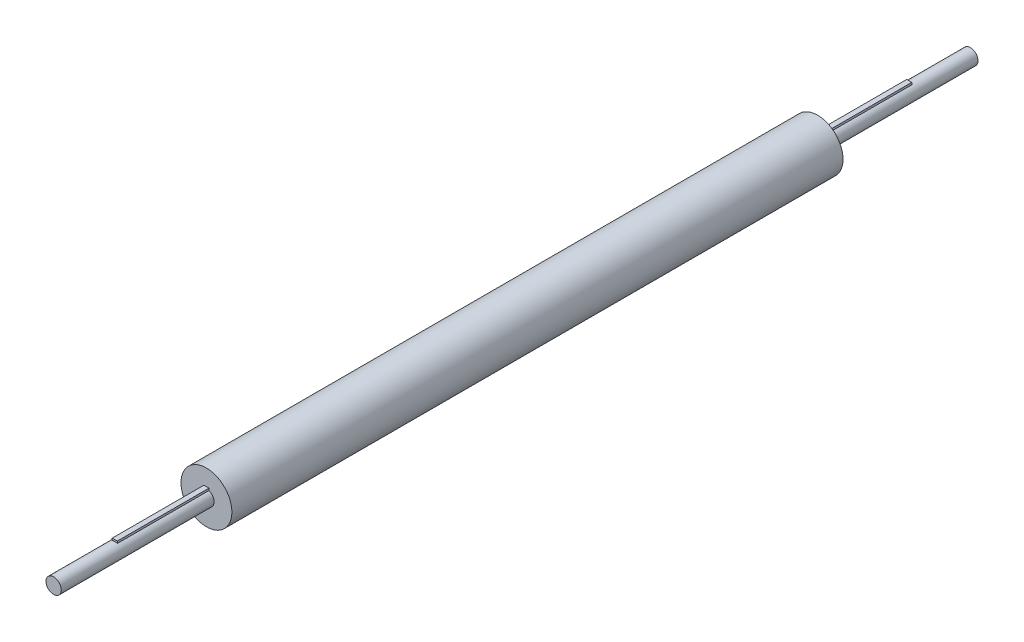
ISO-10303-21;
HEADER;
FILE_DESCRIPTION(('STEP AP214'),'2;1');
FILE_NAME('part.step','',(''),(''),'','','');
FILE_SCHEMA(('AUTOMOTIVE_DESIGN { 1 0 10303 214 1 1 1 1 }'));
ENDSEC;
DATA;
#1=APPLICATION_CONTEXT('core data for automotive mechanical design processes');
#2=APPLICATION_PROTOCOL_DEFINITION('international standard','automotive_design',2000,#1);
#3=PRODUCT_CONTEXT('',#1,'mechanical');
#4=PRODUCT('Part','Part','',(#3));
#5=PRODUCT_RELATED_PRODUCT_CATEGORY('part','',(#4));
#6=PRODUCT_DEFINITION_FORMATION('','',#4);
#7=PRODUCT_DEFINITION_CONTEXT('part definition',#1,'design');
#8=PRODUCT_DEFINITION('design','',#6,#7);
#9=PRODUCT_DEFINITION_SHAPE('','',#8);
#10=(LENGTH_UNIT() NAMED_UNIT(*) SI_UNIT(.MILLI.,.METRE.));
#11=(NAMED_UNIT(*) PLANE_ANGLE_UNIT() SI_UNIT($,.RADIAN.));
#12=(NAMED_UNIT(*) SI_UNIT($,.STERADIAN.) SOLID_ANGLE_UNIT());
#13=UNCERTAINTY_MEASURE_WITH_UNIT(LENGTH_MEASURE(1.E-05),#10,'distance_accuracy_value','');
#14=(GEOMETRIC_REPRESENTATION_CONTEXT(3) GLOBAL_UNCERTAINTY_ASSIGNED_CONTEXT((#13)) GLOBAL_UNIT_ASSIGNED_CONTEXT((#10,
#11,#12)) REPRESENTATION_CONTEXT('',''));
#15=CARTESIAN_POINT('',(0.,0.,0.));
#16=DIRECTION('',(0.,0.,1.));
#17=DIRECTION('',(1.,0.,0.));
#18=AXIS2_PLACEMENT_3D('',#15,#16,#17);
#19=CARTESIAN_POINT('',(-5.,14.1421356237309,800.));
#20=DIRECTION('',(1.,0.,0.));
#21=DIRECTION('',(0.,0.,-1.));
#22=AXIS2_PLACEMENT_3D('',#19,#20,#21);
#23=PLANE('',#22);
#24=DIRECTION('',(0.,1.,0.));
#25=VECTOR('',#24,1.);
#26=CARTESIAN_POINT('',(-5.,14.1421356237309,-780.));
#27=LINE('',#26,#25);
#28=CARTESIAN_POINT('',(-5.,14.1421356237309,-780.));
#29=VERTEX_POINT('',#28);
#30=CARTESIAN_POINT('',(-5.,18.3,-780.));
#31=VERTEX_POINT('',#30);
#32=EDGE_CURVE('E116',#29,#31,#27,.T.);
#33=ORIENTED_EDGE('',*,*,#32,.F.);
#34=DIRECTION('',(0.,0.,-1.));
#35=VECTOR('',#34,1.);
#36=CARTESIAN_POINT('',(-5.,14.1421356237309,800.));
#37=LINE('',#36,#35);
#38=CARTESIAN_POINT('',(-5.,14.1421356237309,-600.));
#39=VERTEX_POINT('',#38);
#40=EDGE_CURVE('E141',#39,#29,#37,.T.);
#41=ORIENTED_EDGE('',*,*,#40,.F.);
#42=DIRECTION('',(0.,-1.,0.));
#43=VECTOR('',#42,1.);
#44=CARTESIAN_POINT('',(-5.,14.1421356237309,-600.));
#45=LINE('',#44,#43);
#46=CARTESIAN_POINT('',(-5.,18.3,-600.));
#47=VERTEX_POINT('',#46);
#48=EDGE_CURVE('E51',#47,#39,#45,.T.);
#49=ORIENTED_EDGE('',*,*,#48,.F.);
#50=DIRECTION('',(0.,0.,-1.));
#51=VECTOR('',#50,1.);
#52=CARTESIAN_POINT('',(-5.,18.3,800.));
#53=LINE('',#52,#51);
#54=EDGE_CURVE('E128',#47,#31,#53,.T.);
#55=ORIENTED_EDGE('',*,*,#54,.T.);
#56=EDGE_LOOP('',(#33,#41,#49,#55));
#57=FACE_BOUND('',#56,.T.);
#58=ADVANCED_FACE('F43',(#57),#23,.F.);
#59=CARTESIAN_POINT('',(-5.,18.3,800.));
#60=DIRECTION('',(0.,-1.,0.));
#61=DIRECTION('',(0.,0.,-1.));
#62=AXIS2_PLACEMENT_3D('',#59,#60,#61);
#63=PLANE('',#62);
#64=DIRECTION('',(1.,0.,0.));
#65=VECTOR('',#64,1.);
#66=CARTESIAN_POINT('',(-5.,18.3,-780.));
#67=LINE('',#66,#65);
#68=CARTESIAN_POINT('',(5.,18.3,-780.));
#69=VERTEX_POINT('',#68);
#70=EDGE_CURVE('E111',#31,#69,#67,.T.);
#71=ORIENTED_EDGE('',*,*,#70,.F.);
#72=ORIENTED_EDGE('',*,*,#54,.F.);
#73=DIRECTION('',(-1.,0.,0.));
#74=VECTOR('',#73,1.);
#75=CARTESIAN_POINT('',(-5.,18.3,-600.));
#76=LINE('',#75,#74);
#77=CARTESIAN_POINT('',(5.,18.3,-600.));
#78=VERTEX_POINT('',#77);
#79=EDGE_CURVE('E66',#78,#47,#76,.T.);
#80=ORIENTED_EDGE('',*,*,#79,.F.);
#81=DIRECTION('',(0.,0.,-1.));
#82=VECTOR('',#81,1.);
#83=CARTESIAN_POINT('',(5.,18.3,800.));
#84=LINE('',#83,#82);
#85=EDGE_CURVE('E120',#78,#69,#84,.T.);
#86=ORIENTED_EDGE('',*,*,#85,.T.);
#87=EDGE_LOOP('',(#71,#72,#80,#86));
#88=FACE_BOUND('',#87,.T.);
#89=ADVANCED_FACE('F124',(#88),#63,.F.);
#90=CARTESIAN_POINT('',(5.,18.3,800.));
#91=DIRECTION('',(-1.,0.,0.));
#92=DIRECTION('',(0.,0.,1.));
#93=AXIS2_PLACEMENT_3D('',#90,#91,#92);
#94=PLANE('',#93);
#95=DIRECTION('',(0.,-1.,0.));
#96=VECTOR('',#95,1.);
#97=CARTESIAN_POINT('',(5.,18.3,-780.));
#98=LINE('',#97,#96);
#99=CARTESIAN_POINT('',(5.,14.1421356237309,-780.));
#100=VERTEX_POINT('',#99);
#101=EDGE_CURVE('E114',#69,#100,#98,.T.);
#102=ORIENTED_EDGE('',*,*,#101,.F.);
#103=ORIENTED_EDGE('',*,*,#85,.F.);
#104=DIRECTION('',(0.,1.,0.));
#105=VECTOR('',#104,1.);
#106=CARTESIAN_POINT('',(5.,18.3,-600.));
#107=LINE('',#106,#105);
#108=CARTESIAN_POINT('',(5.,14.1421356237309,-600.));
#109=VERTEX_POINT('',#108);
#110=EDGE_CURVE('E58',#109,#78,#107,.T.);
#111=ORIENTED_EDGE('',*,*,#110,.F.);
#112=DIRECTION('',(0.,0.,-1.));
#113=VECTOR('',#112,1.);
#114=CARTESIAN_POINT('',(5.,14.1421356237309,800.));
#115=LINE('',#114,#113);
#116=EDGE_CURVE('E121',#109,#100,#115,.T.);
#117=ORIENTED_EDGE('',*,*,#116,.T.);
#118=EDGE_LOOP('',(#102,#103,#111,#117));
#119=FACE_BOUND('',#118,.T.);
#120=ADVANCED_FACE('F119',(#119),#94,.F.);
#121=DIRECTION('',(0.,1.,0.));
#122=VECTOR('',#121,1.);
#123=CARTESIAN_POINT('',(5.,14.1421356237309,780.));
#124=LINE('',#123,#122);
#125=CARTESIAN_POINT('',(5.,14.1421356237309,780.));
#126=VERTEX_POINT('',#125);
#127=CARTESIAN_POINT('',(5.,18.3,780.));
#128=VERTEX_POINT('',#127);
#129=EDGE_CURVE('E176',#126,#128,#124,.T.);
#130=ORIENTED_EDGE('',*,*,#129,.F.);
#131=CARTESIAN_POINT('',(5.,14.1421356237309,600.));
#132=VERTEX_POINT('',#131);
#133=EDGE_CURVE('E132',#126,#132,#115,.T.);
#134=ORIENTED_EDGE('',*,*,#133,.T.);
#135=DIRECTION('',(0.,1.,0.));
#136=VECTOR('',#135,1.);
#137=CARTESIAN_POINT('',(5.,18.3,600.));
#138=LINE('',#137,#136);
#139=CARTESIAN_POINT('',(5.,18.3,600.));
#140=VERTEX_POINT('',#139);
#141=EDGE_CURVE('E150',#132,#140,#138,.T.);
#142=ORIENTED_EDGE('',*,*,#141,.T.);
#143=EDGE_CURVE('E125',#128,#140,#84,.T.);
#144=ORIENTED_EDGE('',*,*,#143,.F.);
#145=EDGE_LOOP('',(#130,#134,#142,#144));
#146=FACE_BOUND('',#145,.T.);
#147=ADVANCED_FACE('F217',(#146),#94,.F.);
#148=DIRECTION('',(-1.,0.,0.));
#149=VECTOR('',#148,1.);
#150=CARTESIAN_POINT('',(5.,18.3,780.));
#151=LINE('',#150,#149);
#152=CARTESIAN_POINT('',(-5.,18.3,780.));
#153=VERTEX_POINT('',#152);
#154=EDGE_CURVE('E174',#128,#153,#151,.T.);
#155=ORIENTED_EDGE('',*,*,#154,.F.);
#156=ORIENTED_EDGE('',*,*,#143,.T.);
#157=DIRECTION('',(-1.,0.,0.));
#158=VECTOR('',#157,1.);
#159=CARTESIAN_POINT('',(-5.,18.3,600.));
#160=LINE('',#159,#158);
#161=CARTESIAN_POINT('',(-5.,18.3,600.));
#162=VERTEX_POINT('',#161);
#163=EDGE_CURVE('E153',#140,#162,#160,.T.);
#164=ORIENTED_EDGE('',*,*,#163,.T.);
#165=EDGE_CURVE('E126',#153,#162,#53,.T.);
#166=ORIENTED_EDGE('',*,*,#165,.F.);
#167=EDGE_LOOP('',(#155,#156,#164,#166));
#168=FACE_BOUND('',#167,.T.);
#169=ADVANCED_FACE('F208',(#168),#63,.F.);
#170=DIRECTION('',(0.,-1.,0.));
#171=VECTOR('',#170,1.);
#172=CARTESIAN_POINT('',(-5.,18.3,780.));
#173=LINE('',#172,#171);
#174=CARTESIAN_POINT('',(-5.,14.1421356237309,780.));
#175=VERTEX_POINT('',#174);
#176=EDGE_CURVE('E171',#153,#175,#173,.T.);
#177=ORIENTED_EDGE('',*,*,#176,.F.);
#178=ORIENTED_EDGE('',*,*,#165,.T.);
#179=DIRECTION('',(0.,-1.,0.));
#180=VECTOR('',#179,1.);
#181=CARTESIAN_POINT('',(-5.,14.1421356237309,600.));
#182=LINE('',#181,#180);
#183=CARTESIAN_POINT('',(-5.,14.1421356237309,600.));
#184=VERTEX_POINT('',#183);
#185=EDGE_CURVE('E11',#162,#184,#182,.T.);
#186=ORIENTED_EDGE('',*,*,#185,.T.);
#187=EDGE_CURVE('E142',#175,#184,#37,.T.);
#188=ORIENTED_EDGE('',*,*,#187,.F.);
#189=EDGE_LOOP('',(#177,#178,#186,#188));
#190=FACE_BOUND('',#189,.T.);
#191=ADVANCED_FACE('F203',(#190),#23,.F.);
#192=CARTESIAN_POINT('',(0.,0.,800.));
#193=DIRECTION('',(0.,0.,-1.));
#194=DIRECTION('',(-1.,0.,0.));
#195=AXIS2_PLACEMENT_3D('',#192,#193,#194);
#196=CYLINDRICAL_SURFACE('',#195,15.);
#197=ORIENTED_EDGE('',*,*,#133,.F.);
#198=CARTESIAN_POINT('',(0.,0.,780.));
#199=DIRECTION('',(0.,0.,-1.));
#200=DIRECTION('',(1.,0.,0.));
#201=AXIS2_PLACEMENT_3D('',#198,#199,#200);
#202=CIRCLE('',#201,15.);
#203=EDGE_CURVE('E178',#175,#126,#202,.T.);
#204=ORIENTED_EDGE('',*,*,#203,.F.);
#205=ORIENTED_EDGE('',*,*,#187,.T.);
#206=CARTESIAN_POINT('',(0.,0.,600.));
#207=DIRECTION('',(0.,0.,1.));
#208=DIRECTION('',(1.,0.,0.));
#209=AXIS2_PLACEMENT_3D('',#206,#207,#208);
#210=CIRCLE('',#209,15.);
#211=EDGE_CURVE('E147',#184,#132,#210,.T.);
#212=ORIENTED_EDGE('',*,*,#211,.T.);
#213=EDGE_LOOP('',(#197,#204,#205,#212));
#214=FACE_BOUND('',#213,.T.);
#215=CARTESIAN_POINT('',(0.,0.,900.));
#216=DIRECTION('',(0.,0.,1.));
#217=DIRECTION('',(1.,0.,0.));
#218=AXIS2_PLACEMENT_3D('',#215,#216,#217);
#219=CIRCLE('',#218,15.);
#220=CARTESIAN_POINT('',(15.,0.,900.));
#221=VERTEX_POINT('',#220);
#222=EDGE_CURVE('E163',#221,#221,#219,.T.);
#223=ORIENTED_EDGE('',*,*,#222,.F.);
#224=EDGE_LOOP('',(#223));
#225=FACE_BOUND('',#224,.T.);
#226=ADVANCED_FACE('F45',(#214,#225),#196,.T.);
#227=CARTESIAN_POINT('',(0.,0.,600.));
#228=DIRECTION('',(0.,0.,1.));
#229=DIRECTION('',(1.,0.,0.));
#230=AXIS2_PLACEMENT_3D('',#227,#228,#229);
#231=PLANE('',#230);
#232=CARTESIAN_POINT('',(0.,0.,600.));
#233=DIRECTION('',(0.,0.,1.));
#234=DIRECTION('',(1.,0.,0.));
#235=AXIS2_PLACEMENT_3D('',#232,#233,#234);
#236=CIRCLE('',#235,50.);
#237=CARTESIAN_POINT('',(50.,0.,600.));
#238=VERTEX_POINT('',#237);
#239=EDGE_CURVE('E159',#238,#238,#236,.T.);
#240=ORIENTED_EDGE('',*,*,#239,.T.);
#241=EDGE_LOOP('',(#240));
#242=FACE_BOUND('',#241,.T.);
#243=ORIENTED_EDGE('',*,*,#211,.F.);
#244=ORIENTED_EDGE('',*,*,#185,.F.);
#245=ORIENTED_EDGE('',*,*,#163,.F.);
#246=ORIENTED_EDGE('',*,*,#141,.F.);
#247=EDGE_LOOP('',(#243,#244,#245,#246));
#248=FACE_BOUND('',#247,.T.);
#249=ADVANCED_FACE('F216',(#242,#248),#231,.T.);
#250=CARTESIAN_POINT('',(0.,0.,-600.));
#251=DIRECTION('',(0.,0.,1.));
#252=DIRECTION('',(1.,0.,0.));
#253=AXIS2_PLACEMENT_3D('',#250,#251,#252);
#254=PLANE('',#253);
#255=CARTESIAN_POINT('',(0.,0.,-600.));
#256=DIRECTION('',(0.,0.,1.));
#257=DIRECTION('',(1.,0.,0.));
#258=AXIS2_PLACEMENT_3D('',#255,#256,#257);
#259=CIRCLE('',#258,50.);
#260=CARTESIAN_POINT('',(50.,0.,-600.));
#261=VERTEX_POINT('',#260);
#262=EDGE_CURVE('E160',#261,#261,#259,.T.);
#263=ORIENTED_EDGE('',*,*,#262,.F.);
#264=EDGE_LOOP('',(#263));
#265=FACE_BOUND('',#264,.T.);
#266=ORIENTED_EDGE('',*,*,#48,.T.);
#267=CARTESIAN_POINT('',(0.,0.,-600.));
#268=DIRECTION('',(0.,0.,1.));
#269=DIRECTION('',(1.,0.,0.));
#270=AXIS2_PLACEMENT_3D('',#267,#268,#269);
#271=CIRCLE('',#270,15.);
#272=EDGE_CURVE('E138',#39,#109,#271,.T.);
#273=ORIENTED_EDGE('',*,*,#272,.T.);
#274=ORIENTED_EDGE('',*,*,#110,.T.);
#275=ORIENTED_EDGE('',*,*,#79,.T.);
#276=EDGE_LOOP('',(#266,#273,#274,#275));
#277=FACE_BOUND('',#276,.T.);
#278=ADVANCED_FACE('F136',(#265,#277),#254,.F.);
#279=CARTESIAN_POINT('',(0.,0.,600.));
#280=DIRECTION('',(0.,0.,-1.));
#281=DIRECTION('',(-1.,0.,0.));
#282=AXIS2_PLACEMENT_3D('',#279,#280,#281);
#283=CYLINDRICAL_SURFACE('',#282,50.);
#284=ORIENTED_EDGE('',*,*,#239,.F.);
#285=EDGE_LOOP('',(#284));
#286=FACE_BOUND('',#285,.T.);
#287=ORIENTED_EDGE('',*,*,#262,.T.);
#288=EDGE_LOOP('',(#287));
#289=FACE_BOUND('',#288,.T.);
#290=ADVANCED_FACE('F186',(#286,#289),#283,.T.);
#291=ORIENTED_EDGE('',*,*,#272,.F.);
#292=ORIENTED_EDGE('',*,*,#40,.T.);
#293=CARTESIAN_POINT('',(0.,0.,-780.));
#294=DIRECTION('',(0.,0.,1.));
#295=DIRECTION('',(-1.,0.,0.));
#296=AXIS2_PLACEMENT_3D('',#293,#294,#295);
#297=CIRCLE('',#296,15.);
#298=EDGE_CURVE('E122',#100,#29,#297,.T.);
#299=ORIENTED_EDGE('',*,*,#298,.F.);
#300=ORIENTED_EDGE('',*,*,#116,.F.);
#301=EDGE_LOOP('',(#291,#292,#299,#300));
#302=FACE_BOUND('',#301,.T.);
#303=CARTESIAN_POINT('',(0.,0.,-900.));
#304=DIRECTION('',(0.,0.,1.));
#305=DIRECTION('',(1.,0.,0.));
#306=AXIS2_PLACEMENT_3D('',#303,#304,#305);
#307=CIRCLE('',#306,15.);
#308=CARTESIAN_POINT('',(15.,0.,-900.));
#309=VERTEX_POINT('',#308);
#310=EDGE_CURVE('E168',#309,#309,#307,.T.);
#311=ORIENTED_EDGE('',*,*,#310,.T.);
#312=EDGE_LOOP('',(#311));
#313=FACE_BOUND('',#312,.T.);
#314=ADVANCED_FACE('F182',(#302,#313),#196,.T.);
#315=CARTESIAN_POINT('',(0.,0.,900.));
#316=DIRECTION('',(0.,0.,1.));
#317=DIRECTION('',(1.,0.,0.));
#318=AXIS2_PLACEMENT_3D('',#315,#316,#317);
#319=PLANE('',#318);
#320=ORIENTED_EDGE('',*,*,#222,.T.);
#321=EDGE_LOOP('',(#320));
#322=FACE_BOUND('',#321,.T.);
#323=ADVANCED_FACE('F185',(#322),#319,.T.);
#324=CARTESIAN_POINT('',(0.,0.,-900.));
#325=DIRECTION('',(0.,0.,-1.));
#326=DIRECTION('',(1.,0.,0.));
#327=AXIS2_PLACEMENT_3D('',#324,#325,#326);
#328=PLANE('',#327);
#329=ORIENTED_EDGE('',*,*,#310,.F.);
#330=EDGE_LOOP('',(#329));
#331=FACE_BOUND('',#330,.T.);
#332=ADVANCED_FACE('F189',(#331),#328,.T.);
#333=CARTESIAN_POINT('',(0.,0.,780.));
#334=DIRECTION('',(0.,0.,1.));
#335=DIRECTION('',(1.,0.,0.));
#336=AXIS2_PLACEMENT_3D('',#333,#334,#335);
#337=PLANE('',#336);
#338=ORIENTED_EDGE('',*,*,#203,.T.);
#339=ORIENTED_EDGE('',*,*,#129,.T.);
#340=ORIENTED_EDGE('',*,*,#154,.T.);
#341=ORIENTED_EDGE('',*,*,#176,.T.);
#342=EDGE_LOOP('',(#338,#339,#340,#341));
#343=FACE_BOUND('',#342,.T.);
#344=ADVANCED_FACE('F191',(#343),#337,.T.);
#345=CARTESIAN_POINT('',(0.,0.,-780.));
#346=DIRECTION('',(0.,0.,-1.));
#347=DIRECTION('',(-1.,0.,0.));
#348=AXIS2_PLACEMENT_3D('',#345,#346,#347);
#349=PLANE('',#348);
#350=ORIENTED_EDGE('',*,*,#70,.T.);
#351=ORIENTED_EDGE('',*,*,#101,.T.);
#352=ORIENTED_EDGE('',*,*,#298,.T.);
#353=ORIENTED_EDGE('',*,*,#32,.T.);
#354=EDGE_LOOP('',(#350,#351,#352,#353));
#355=FACE_BOUND('',#354,.T.);
#356=ADVANCED_FACE('F113',(#355),#349,.T.);
#357=CLOSED_SHELL('',(#58,#89,#120,#147,#169,#191,#226,#249,#278,#290,#314,#323,#332,#344,#356));
#358=MANIFOLD_SOLID_BREP('B2',#357);
#359=ADVANCED_BREP_SHAPE_REPRESENTATION('',(#18,#358),#14);
#360=SHAPE_DEFINITION_REPRESENTATION(#9,#359);
ENDSEC;
END-ISO-10303-21;
